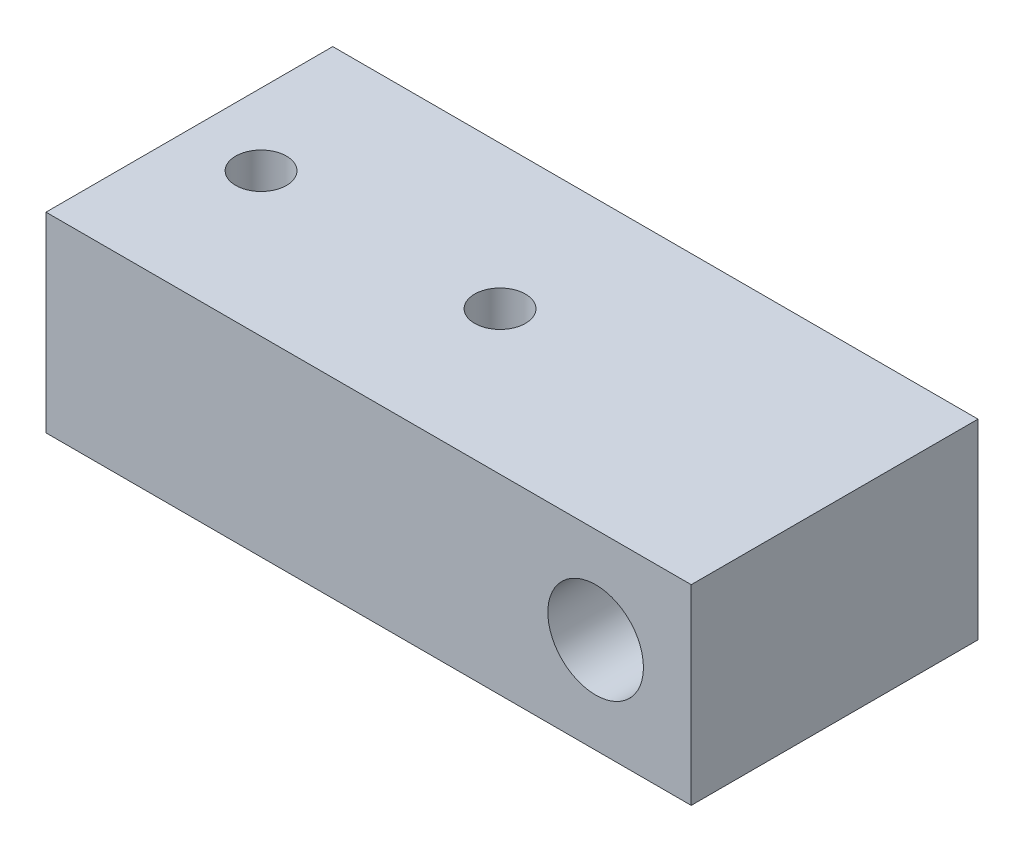
ISO-10303-21;
HEADER;
FILE_DESCRIPTION(('STEP AP214'),'2;1');
FILE_NAME('part.step','',(''),(''),'','','');
FILE_SCHEMA(('AUTOMOTIVE_DESIGN { 1 0 10303 214 1 1 1 1 }'));
ENDSEC;
DATA;
#1=APPLICATION_CONTEXT('core data for automotive mechanical design processes');
#2=APPLICATION_PROTOCOL_DEFINITION('international standard','automotive_design',2000,#1);
#3=PRODUCT_CONTEXT('',#1,'mechanical');
#4=PRODUCT('Part','Part','',(#3));
#5=PRODUCT_RELATED_PRODUCT_CATEGORY('part','',(#4));
#6=PRODUCT_DEFINITION_FORMATION('','',#4);
#7=PRODUCT_DEFINITION_CONTEXT('part definition',#1,'design');
#8=PRODUCT_DEFINITION('design','',#6,#7);
#9=PRODUCT_DEFINITION_SHAPE('','',#8);
#10=(LENGTH_UNIT() NAMED_UNIT(*) SI_UNIT(.MILLI.,.METRE.));
#11=(NAMED_UNIT(*) PLANE_ANGLE_UNIT() SI_UNIT($,.RADIAN.));
#12=(NAMED_UNIT(*) SI_UNIT($,.STERADIAN.) SOLID_ANGLE_UNIT());
#13=UNCERTAINTY_MEASURE_WITH_UNIT(LENGTH_MEASURE(1.E-05),#10,'distance_accuracy_value','');
#14=(GEOMETRIC_REPRESENTATION_CONTEXT(3) GLOBAL_UNCERTAINTY_ASSIGNED_CONTEXT((#13)) GLOBAL_UNIT_ASSIGNED_CONTEXT((#10,
#11,#12)) REPRESENTATION_CONTEXT('',''));
#15=CARTESIAN_POINT('',(0.,0.,0.));
#16=DIRECTION('',(0.,0.,1.));
#17=DIRECTION('',(1.,0.,0.));
#18=AXIS2_PLACEMENT_3D('',#15,#16,#17);
#19=CARTESIAN_POINT('',(42.8625,12.7,-19.05));
#20=DIRECTION('',(-1.,0.,0.));
#21=DIRECTION('',(0.,0.,1.));
#22=AXIS2_PLACEMENT_3D('',#19,#20,#21);
#23=PLANE('',#22);
#24=DIRECTION('',(0.,0.,-1.));
#25=VECTOR('',#24,1.);
#26=CARTESIAN_POINT('',(42.8625,-12.7,-19.05));
#27=LINE('',#26,#25);
#28=CARTESIAN_POINT('',(42.8625,-12.7,19.05));
#29=VERTEX_POINT('',#28);
#30=CARTESIAN_POINT('',(42.8625,-12.7,-19.05));
#31=VERTEX_POINT('',#30);
#32=EDGE_CURVE('E98',#29,#31,#27,.T.);
#33=ORIENTED_EDGE('',*,*,#32,.T.);
#34=DIRECTION('',(0.,-1.,0.));
#35=VECTOR('',#34,1.);
#36=CARTESIAN_POINT('',(42.8625,12.7,-19.05));
#37=LINE('',#36,#35);
#38=CARTESIAN_POINT('',(42.8625,12.7,-19.05));
#39=VERTEX_POINT('',#38);
#40=EDGE_CURVE('E11',#39,#31,#37,.T.);
#41=ORIENTED_EDGE('',*,*,#40,.F.);
#42=DIRECTION('',(0.,0.,-1.));
#43=VECTOR('',#42,1.);
#44=CARTESIAN_POINT('',(42.8625,12.7,-19.05));
#45=LINE('',#44,#43);
#46=CARTESIAN_POINT('',(42.8625,12.7,19.05));
#47=VERTEX_POINT('',#46);
#48=EDGE_CURVE('E86',#47,#39,#45,.T.);
#49=ORIENTED_EDGE('',*,*,#48,.F.);
#50=DIRECTION('',(0.,-1.,0.));
#51=VECTOR('',#50,1.);
#52=CARTESIAN_POINT('',(42.8625,12.7,19.05));
#53=LINE('',#52,#51);
#54=EDGE_CURVE('E94',#47,#29,#53,.T.);
#55=ORIENTED_EDGE('',*,*,#54,.T.);
#56=EDGE_LOOP('',(#33,#41,#49,#55));
#57=FACE_BOUND('',#56,.T.);
#58=ADVANCED_FACE('F35',(#57),#23,.F.);
#59=CARTESIAN_POINT('',(-42.8625,12.7,-19.05));
#60=DIRECTION('',(0.,0.,1.));
#61=DIRECTION('',(1.,0.,0.));
#62=AXIS2_PLACEMENT_3D('',#59,#60,#61);
#63=PLANE('',#62);
#64=CARTESIAN_POINT('',(30.1625,0.,-19.05));
#65=DIRECTION('',(0.,0.,1.));
#66=DIRECTION('',(1.,0.,0.));
#67=AXIS2_PLACEMENT_3D('',#64,#65,#66);
#68=CIRCLE('',#67,6.34999999999999);
#69=CARTESIAN_POINT('',(36.5125,0.,-19.05));
#70=VERTEX_POINT('',#69);
#71=EDGE_CURVE('E101',#70,#70,#68,.T.);
#72=ORIENTED_EDGE('',*,*,#71,.T.);
#73=EDGE_LOOP('',(#72));
#74=FACE_BOUND('',#73,.T.);
#75=DIRECTION('',(-1.,0.,0.));
#76=VECTOR('',#75,1.);
#77=CARTESIAN_POINT('',(-42.8625,-12.7,-19.05));
#78=LINE('',#77,#76);
#79=CARTESIAN_POINT('',(-42.8625,-12.7,-19.05));
#80=VERTEX_POINT('',#79);
#81=EDGE_CURVE('E90',#31,#80,#78,.T.);
#82=ORIENTED_EDGE('',*,*,#81,.T.);
#83=DIRECTION('',(0.,-1.,0.));
#84=VECTOR('',#83,1.);
#85=CARTESIAN_POINT('',(-42.8625,12.7,-19.05));
#86=LINE('',#85,#84);
#87=CARTESIAN_POINT('',(-42.8625,12.7,-19.05));
#88=VERTEX_POINT('',#87);
#89=EDGE_CURVE('E43',#88,#80,#86,.T.);
#90=ORIENTED_EDGE('',*,*,#89,.F.);
#91=DIRECTION('',(-1.,0.,0.));
#92=VECTOR('',#91,1.);
#93=CARTESIAN_POINT('',(-42.8625,12.7,-19.05));
#94=LINE('',#93,#92);
#95=EDGE_CURVE('E81',#39,#88,#94,.T.);
#96=ORIENTED_EDGE('',*,*,#95,.F.);
#97=ORIENTED_EDGE('',*,*,#40,.T.);
#98=EDGE_LOOP('',(#82,#90,#96,#97));
#99=FACE_BOUND('',#98,.T.);
#100=ADVANCED_FACE('F89',(#74,#99),#63,.F.);
#101=CARTESIAN_POINT('',(-42.8625,12.7,-19.05));
#102=DIRECTION('',(1.,0.,0.));
#103=DIRECTION('',(0.,0.,-1.));
#104=AXIS2_PLACEMENT_3D('',#101,#102,#103);
#105=PLANE('',#104);
#106=DIRECTION('',(0.,0.,1.));
#107=VECTOR('',#106,1.);
#108=CARTESIAN_POINT('',(-42.8625,-12.7,-19.05));
#109=LINE('',#108,#107);
#110=CARTESIAN_POINT('',(-42.8625,-12.7,19.05));
#111=VERTEX_POINT('',#110);
#112=EDGE_CURVE('E68',#80,#111,#109,.T.);
#113=ORIENTED_EDGE('',*,*,#112,.T.);
#114=DIRECTION('',(0.,-1.,0.));
#115=VECTOR('',#114,1.);
#116=CARTESIAN_POINT('',(-42.8625,12.7,19.05));
#117=LINE('',#116,#115);
#118=CARTESIAN_POINT('',(-42.8625,12.7,19.05));
#119=VERTEX_POINT('',#118);
#120=EDGE_CURVE('E91',#119,#111,#117,.T.);
#121=ORIENTED_EDGE('',*,*,#120,.F.);
#122=DIRECTION('',(0.,0.,1.));
#123=VECTOR('',#122,1.);
#124=CARTESIAN_POINT('',(-42.8625,12.7,-19.05));
#125=LINE('',#124,#123);
#126=EDGE_CURVE('E84',#88,#119,#125,.T.);
#127=ORIENTED_EDGE('',*,*,#126,.F.);
#128=ORIENTED_EDGE('',*,*,#89,.T.);
#129=EDGE_LOOP('',(#113,#121,#127,#128));
#130=FACE_BOUND('',#129,.T.);
#131=ADVANCED_FACE('F92',(#130),#105,.F.);
#132=CARTESIAN_POINT('',(-42.8625,12.7,19.05));
#133=DIRECTION('',(0.,0.,-1.));
#134=DIRECTION('',(-1.,0.,0.));
#135=AXIS2_PLACEMENT_3D('',#132,#133,#134);
#136=PLANE('',#135);
#137=CARTESIAN_POINT('',(30.1625,0.,19.05));
#138=DIRECTION('',(0.,0.,1.));
#139=DIRECTION('',(1.,0.,0.));
#140=AXIS2_PLACEMENT_3D('',#137,#138,#139);
#141=CIRCLE('',#140,6.35);
#142=CARTESIAN_POINT('',(36.5125,0.,19.05));
#143=VERTEX_POINT('',#142);
#144=EDGE_CURVE('E114',#143,#143,#141,.T.);
#145=ORIENTED_EDGE('',*,*,#144,.F.);
#146=EDGE_LOOP('',(#145));
#147=FACE_BOUND('',#146,.T.);
#148=DIRECTION('',(1.,0.,0.));
#149=VECTOR('',#148,1.);
#150=CARTESIAN_POINT('',(-42.8625,-12.7,19.05));
#151=LINE('',#150,#149);
#152=EDGE_CURVE('E74',#111,#29,#151,.T.);
#153=ORIENTED_EDGE('',*,*,#152,.T.);
#154=ORIENTED_EDGE('',*,*,#54,.F.);
#155=DIRECTION('',(1.,0.,0.));
#156=VECTOR('',#155,1.);
#157=CARTESIAN_POINT('',(-42.8625,12.7,19.05));
#158=LINE('',#157,#156);
#159=EDGE_CURVE('E51',#119,#47,#158,.T.);
#160=ORIENTED_EDGE('',*,*,#159,.F.);
#161=ORIENTED_EDGE('',*,*,#120,.T.);
#162=EDGE_LOOP('',(#153,#154,#160,#161));
#163=FACE_BOUND('',#162,.T.);
#164=ADVANCED_FACE('F106',(#147,#163),#136,.F.);
#165=CARTESIAN_POINT('',(0.,12.7,0.));
#166=DIRECTION('',(0.,1.,0.));
#167=DIRECTION('',(0.,0.,1.));
#168=AXIS2_PLACEMENT_3D('',#165,#166,#167);
#169=PLANE('',#168);
#170=CARTESIAN_POINT('',(-33.3375,12.7,0.));
#171=DIRECTION('',(0.,1.,0.));
#172=DIRECTION('',(0.,0.,1.));
#173=AXIS2_PLACEMENT_3D('',#170,#171,#172);
#174=CIRCLE('',#173,3.3782);
#175=CARTESIAN_POINT('',(-33.3375,12.7,3.3782));
#176=VERTEX_POINT('',#175);
#177=EDGE_CURVE('E126',#176,#176,#174,.T.);
#178=ORIENTED_EDGE('',*,*,#177,.F.);
#179=EDGE_LOOP('',(#178));
#180=FACE_BOUND('',#179,.T.);
#181=CARTESIAN_POINT('',(-1.5875,12.7,0.));
#182=DIRECTION('',(0.,1.,0.));
#183=DIRECTION('',(0.,0.,1.));
#184=AXIS2_PLACEMENT_3D('',#181,#182,#183);
#185=CIRCLE('',#184,3.3782);
#186=CARTESIAN_POINT('',(-1.5875,12.7,3.3782));
#187=VERTEX_POINT('',#186);
#188=EDGE_CURVE('E120',#187,#187,#185,.T.);
#189=ORIENTED_EDGE('',*,*,#188,.F.);
#190=EDGE_LOOP('',(#189));
#191=FACE_BOUND('',#190,.T.);
#192=ORIENTED_EDGE('',*,*,#48,.T.);
#193=ORIENTED_EDGE('',*,*,#95,.T.);
#194=ORIENTED_EDGE('',*,*,#126,.T.);
#195=ORIENTED_EDGE('',*,*,#159,.T.);
#196=EDGE_LOOP('',(#192,#193,#194,#195));
#197=FACE_BOUND('',#196,.T.);
#198=ADVANCED_FACE('F82',(#180,#191,#197),#169,.T.);
#199=CARTESIAN_POINT('',(0.,-12.7,0.));
#200=DIRECTION('',(0.,1.,0.));
#201=DIRECTION('',(0.,0.,1.));
#202=AXIS2_PLACEMENT_3D('',#199,#200,#201);
#203=PLANE('',#202);
#204=CARTESIAN_POINT('',(-33.3375,-12.7,0.));
#205=DIRECTION('',(0.,1.,0.));
#206=DIRECTION('',(0.,0.,1.));
#207=AXIS2_PLACEMENT_3D('',#204,#205,#206);
#208=CIRCLE('',#207,3.37819999999999);
#209=CARTESIAN_POINT('',(-33.3375,-12.7,3.37819999999999));
#210=VERTEX_POINT('',#209);
#211=EDGE_CURVE('E123',#210,#210,#208,.T.);
#212=ORIENTED_EDGE('',*,*,#211,.T.);
#213=EDGE_LOOP('',(#212));
#214=FACE_BOUND('',#213,.T.);
#215=CARTESIAN_POINT('',(-1.5875,-12.7,0.));
#216=DIRECTION('',(0.,1.,0.));
#217=DIRECTION('',(0.,0.,1.));
#218=AXIS2_PLACEMENT_3D('',#215,#216,#217);
#219=CIRCLE('',#218,3.37819999999999);
#220=CARTESIAN_POINT('',(-1.5875,-12.7,3.37819999999999));
#221=VERTEX_POINT('',#220);
#222=EDGE_CURVE('E117',#221,#221,#219,.T.);
#223=ORIENTED_EDGE('',*,*,#222,.T.);
#224=EDGE_LOOP('',(#223));
#225=FACE_BOUND('',#224,.T.);
#226=ORIENTED_EDGE('',*,*,#32,.F.);
#227=ORIENTED_EDGE('',*,*,#152,.F.);
#228=ORIENTED_EDGE('',*,*,#112,.F.);
#229=ORIENTED_EDGE('',*,*,#81,.F.);
#230=EDGE_LOOP('',(#226,#227,#228,#229));
#231=FACE_BOUND('',#230,.T.);
#232=ADVANCED_FACE('F109',(#214,#225,#231),#203,.F.);
#233=CARTESIAN_POINT('',(30.1625,0.,19.05));
#234=DIRECTION('',(0.,0.,1.));
#235=DIRECTION('',(1.,0.,0.));
#236=AXIS2_PLACEMENT_3D('',#233,#234,#235);
#237=CYLINDRICAL_SURFACE('',#236,6.34999999999999);
#238=ORIENTED_EDGE('',*,*,#71,.F.);
#239=EDGE_LOOP('',(#238));
#240=FACE_BOUND('',#239,.T.);
#241=ORIENTED_EDGE('',*,*,#144,.T.);
#242=EDGE_LOOP('',(#241));
#243=FACE_BOUND('',#242,.T.);
#244=ADVANCED_FACE('F139',(#240,#243),#237,.F.);
#245=CARTESIAN_POINT('',(-1.5875,12.7,0.));
#246=DIRECTION('',(0.,1.,0.));
#247=DIRECTION('',(0.,0.,1.));
#248=AXIS2_PLACEMENT_3D('',#245,#246,#247);
#249=CYLINDRICAL_SURFACE('',#248,3.3782);
#250=ORIENTED_EDGE('',*,*,#222,.F.);
#251=EDGE_LOOP('',(#250));
#252=FACE_BOUND('',#251,.T.);
#253=ORIENTED_EDGE('',*,*,#188,.T.);
#254=EDGE_LOOP('',(#253));
#255=FACE_BOUND('',#254,.T.);
#256=ADVANCED_FACE('F137',(#252,#255),#249,.F.);
#257=CARTESIAN_POINT('',(-33.3375,12.7,0.));
#258=DIRECTION('',(0.,1.,0.));
#259=DIRECTION('',(0.,0.,1.));
#260=AXIS2_PLACEMENT_3D('',#257,#258,#259);
#261=CYLINDRICAL_SURFACE('',#260,3.3782);
#262=ORIENTED_EDGE('',*,*,#211,.F.);
#263=EDGE_LOOP('',(#262));
#264=FACE_BOUND('',#263,.T.);
#265=ORIENTED_EDGE('',*,*,#177,.T.);
#266=EDGE_LOOP('',(#265));
#267=FACE_BOUND('',#266,.T.);
#268=ADVANCED_FACE('F130',(#264,#267),#261,.F.);
#269=CLOSED_SHELL('',(#58,#100,#131,#164,#198,#232,#244,#256,#268));
#270=MANIFOLD_SOLID_BREP('B2',#269);
#271=ADVANCED_BREP_SHAPE_REPRESENTATION('',(#18,#270),#14);
#272=SHAPE_DEFINITION_REPRESENTATION(#9,#271);
ENDSEC;
END-ISO-10303-21;
